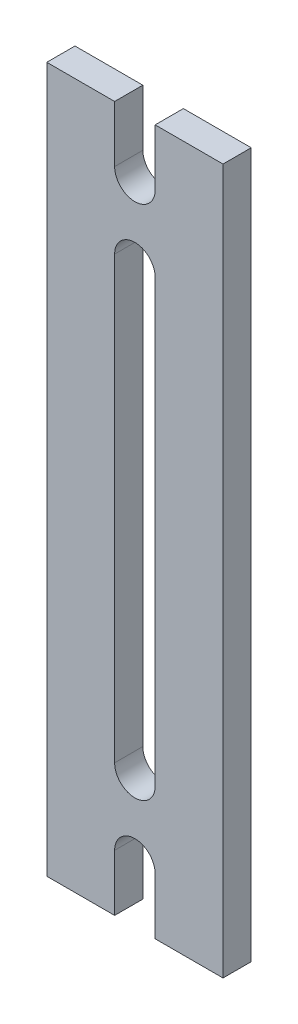
ISO-10303-21;
HEADER;
FILE_DESCRIPTION(('STEP AP214'),'2;1');
FILE_NAME('part.step','',(''),(''),'','','');
FILE_SCHEMA(('AUTOMOTIVE_DESIGN { 1 0 10303 214 1 1 1 1 }'));
ENDSEC;
DATA;
#1=APPLICATION_CONTEXT('core data for automotive mechanical design processes');
#2=APPLICATION_PROTOCOL_DEFINITION('international standard','automotive_design',2000,#1);
#3=PRODUCT_CONTEXT('',#1,'mechanical');
#4=PRODUCT('Part','Part','',(#3));
#5=PRODUCT_RELATED_PRODUCT_CATEGORY('part','',(#4));
#6=PRODUCT_DEFINITION_FORMATION('','',#4);
#7=PRODUCT_DEFINITION_CONTEXT('part definition',#1,'design');
#8=PRODUCT_DEFINITION('design','',#6,#7);
#9=PRODUCT_DEFINITION_SHAPE('','',#8);
#10=(LENGTH_UNIT() NAMED_UNIT(*) SI_UNIT(.MILLI.,.METRE.));
#11=(NAMED_UNIT(*) PLANE_ANGLE_UNIT() SI_UNIT($,.RADIAN.));
#12=(NAMED_UNIT(*) SI_UNIT($,.STERADIAN.) SOLID_ANGLE_UNIT());
#13=UNCERTAINTY_MEASURE_WITH_UNIT(LENGTH_MEASURE(1.E-05),#10,'distance_accuracy_value','');
#14=(GEOMETRIC_REPRESENTATION_CONTEXT(3) GLOBAL_UNCERTAINTY_ASSIGNED_CONTEXT((#13)) GLOBAL_UNIT_ASSIGNED_CONTEXT((#10,
#11,#12)) REPRESENTATION_CONTEXT('',''));
#15=CARTESIAN_POINT('',(0.,0.,0.));
#16=DIRECTION('',(0.,0.,1.));
#17=DIRECTION('',(1.,0.,0.));
#18=AXIS2_PLACEMENT_3D('',#15,#16,#17);
#19=CARTESIAN_POINT('',(-5.,20.,1.6));
#20=DIRECTION('',(0.,-1.,0.));
#21=DIRECTION('',(0.,0.,-1.));
#22=AXIS2_PLACEMENT_3D('',#19,#20,#21);
#23=PLANE('',#22);
#24=DIRECTION('',(-1.,0.,0.));
#25=VECTOR('',#24,1.);
#26=CARTESIAN_POINT('',(-5.,20.,0.));
#27=LINE('',#26,#25);
#28=CARTESIAN_POINT('',(5.,20.,0.));
#29=VERTEX_POINT('',#28);
#30=CARTESIAN_POINT('',(1.15000000000001,20.,0.));
#31=VERTEX_POINT('',#30);
#32=EDGE_CURVE('E250',#29,#31,#27,.T.);
#33=ORIENTED_EDGE('',*,*,#32,.T.);
#34=DIRECTION('',(0.,0.,1.));
#35=VECTOR('',#34,1.);
#36=CARTESIAN_POINT('',(1.15000000000001,20.,1.6));
#37=LINE('',#36,#35);
#38=CARTESIAN_POINT('',(1.15000000000001,20.,1.6));
#39=VERTEX_POINT('',#38);
#40=EDGE_CURVE('E158',#31,#39,#37,.T.);
#41=ORIENTED_EDGE('',*,*,#40,.T.);
#42=DIRECTION('',(-1.,0.,0.));
#43=VECTOR('',#42,1.);
#44=CARTESIAN_POINT('',(-5.,20.,1.6));
#45=LINE('',#44,#43);
#46=CARTESIAN_POINT('',(5.,20.,1.6));
#47=VERTEX_POINT('',#46);
#48=EDGE_CURVE('E237',#47,#39,#45,.T.);
#49=ORIENTED_EDGE('',*,*,#48,.F.);
#50=DIRECTION('',(0.,0.,-1.));
#51=VECTOR('',#50,1.);
#52=CARTESIAN_POINT('',(5.,20.,1.6));
#53=LINE('',#52,#51);
#54=EDGE_CURVE('E265',#47,#29,#53,.T.);
#55=ORIENTED_EDGE('',*,*,#54,.T.);
#56=EDGE_LOOP('',(#33,#41,#49,#55));
#57=FACE_BOUND('',#56,.T.);
#58=ADVANCED_FACE('F33',(#57),#23,.F.);
#59=CARTESIAN_POINT('',(-5.,-20.,1.6));
#60=DIRECTION('',(0.,1.,0.));
#61=DIRECTION('',(0.,0.,1.));
#62=AXIS2_PLACEMENT_3D('',#59,#60,#61);
#63=PLANE('',#62);
#64=DIRECTION('',(1.,0.,0.));
#65=VECTOR('',#64,1.);
#66=CARTESIAN_POINT('',(-5.,-20.,1.6));
#67=LINE('',#66,#65);
#68=CARTESIAN_POINT('',(1.15,-20.,1.6));
#69=VERTEX_POINT('',#68);
#70=CARTESIAN_POINT('',(5.,-20.,1.6));
#71=VERTEX_POINT('',#70);
#72=EDGE_CURVE('E242',#69,#71,#67,.T.);
#73=ORIENTED_EDGE('',*,*,#72,.F.);
#74=DIRECTION('',(0.,0.,-1.));
#75=VECTOR('',#74,1.);
#76=CARTESIAN_POINT('',(1.15,-20.,1.6));
#77=LINE('',#76,#75);
#78=CARTESIAN_POINT('',(1.15,-20.,0.));
#79=VERTEX_POINT('',#78);
#80=EDGE_CURVE('E192',#69,#79,#77,.T.);
#81=ORIENTED_EDGE('',*,*,#80,.T.);
#82=DIRECTION('',(1.,0.,0.));
#83=VECTOR('',#82,1.);
#84=CARTESIAN_POINT('',(-5.,-20.,0.));
#85=LINE('',#84,#83);
#86=CARTESIAN_POINT('',(5.,-20.,0.));
#87=VERTEX_POINT('',#86);
#88=EDGE_CURVE('E254',#79,#87,#85,.T.);
#89=ORIENTED_EDGE('',*,*,#88,.T.);
#90=DIRECTION('',(0.,0.,-1.));
#91=VECTOR('',#90,1.);
#92=CARTESIAN_POINT('',(5.,-20.,1.6));
#93=LINE('',#92,#91);
#94=EDGE_CURVE('E246',#71,#87,#93,.T.);
#95=ORIENTED_EDGE('',*,*,#94,.F.);
#96=EDGE_LOOP('',(#73,#81,#89,#95));
#97=FACE_BOUND('',#96,.T.);
#98=ADVANCED_FACE('F275',(#97),#63,.F.);
#99=CARTESIAN_POINT('',(5.,-20.,1.6));
#100=DIRECTION('',(-1.,0.,0.));
#101=DIRECTION('',(0.,0.,1.));
#102=AXIS2_PLACEMENT_3D('',#99,#100,#101);
#103=PLANE('',#102);
#104=DIRECTION('',(0.,1.,0.));
#105=VECTOR('',#104,1.);
#106=CARTESIAN_POINT('',(5.,-20.,0.));
#107=LINE('',#106,#105);
#108=EDGE_CURVE('E225',#87,#29,#107,.T.);
#109=ORIENTED_EDGE('',*,*,#108,.T.);
#110=ORIENTED_EDGE('',*,*,#54,.F.);
#111=DIRECTION('',(0.,1.,0.));
#112=VECTOR('',#111,1.);
#113=CARTESIAN_POINT('',(5.,-20.,1.6));
#114=LINE('',#113,#112);
#115=EDGE_CURVE('E232',#71,#47,#114,.T.);
#116=ORIENTED_EDGE('',*,*,#115,.F.);
#117=ORIENTED_EDGE('',*,*,#94,.T.);
#118=EDGE_LOOP('',(#109,#110,#116,#117));
#119=FACE_BOUND('',#118,.T.);
#120=ADVANCED_FACE('F35',(#119),#103,.F.);
#121=CARTESIAN_POINT('',(-1.15,20.,1.6));
#122=VERTEX_POINT('',#121);
#123=CARTESIAN_POINT('',(-5.,20.,1.6));
#124=VERTEX_POINT('',#123);
#125=EDGE_CURVE('E235',#122,#124,#45,.T.);
#126=ORIENTED_EDGE('',*,*,#125,.F.);
#127=DIRECTION('',(0.,0.,-1.));
#128=VECTOR('',#127,1.);
#129=CARTESIAN_POINT('',(-1.15,20.,1.6));
#130=LINE('',#129,#128);
#131=CARTESIAN_POINT('',(-1.15,20.,0.));
#132=VERTEX_POINT('',#131);
#133=EDGE_CURVE('E195',#122,#132,#130,.T.);
#134=ORIENTED_EDGE('',*,*,#133,.T.);
#135=CARTESIAN_POINT('',(-5.,20.,0.));
#136=VERTEX_POINT('',#135);
#137=EDGE_CURVE('E249',#132,#136,#27,.T.);
#138=ORIENTED_EDGE('',*,*,#137,.T.);
#139=DIRECTION('',(0.,0.,-1.));
#140=VECTOR('',#139,1.);
#141=CARTESIAN_POINT('',(-5.,20.,1.6));
#142=LINE('',#141,#140);
#143=EDGE_CURVE('E262',#124,#136,#142,.T.);
#144=ORIENTED_EDGE('',*,*,#143,.F.);
#145=EDGE_LOOP('',(#126,#134,#138,#144));
#146=FACE_BOUND('',#145,.T.);
#147=ADVANCED_FACE('F299',(#146),#23,.F.);
#148=CARTESIAN_POINT('',(-5.,-20.,1.6));
#149=DIRECTION('',(1.,0.,0.));
#150=DIRECTION('',(0.,0.,-1.));
#151=AXIS2_PLACEMENT_3D('',#148,#149,#150);
#152=PLANE('',#151);
#153=DIRECTION('',(0.,-1.,0.));
#154=VECTOR('',#153,1.);
#155=CARTESIAN_POINT('',(-5.,-20.,0.));
#156=LINE('',#155,#154);
#157=CARTESIAN_POINT('',(-5.,-20.,0.));
#158=VERTEX_POINT('',#157);
#159=EDGE_CURVE('E252',#136,#158,#156,.T.);
#160=ORIENTED_EDGE('',*,*,#159,.T.);
#161=DIRECTION('',(0.,0.,-1.));
#162=VECTOR('',#161,1.);
#163=CARTESIAN_POINT('',(-5.,-20.,1.6));
#164=LINE('',#163,#162);
#165=CARTESIAN_POINT('',(-5.,-20.,1.6));
#166=VERTEX_POINT('',#165);
#167=EDGE_CURVE('E259',#166,#158,#164,.T.);
#168=ORIENTED_EDGE('',*,*,#167,.F.);
#169=DIRECTION('',(0.,-1.,0.));
#170=VECTOR('',#169,1.);
#171=CARTESIAN_POINT('',(-5.,-20.,1.6));
#172=LINE('',#171,#170);
#173=EDGE_CURVE('E240',#124,#166,#172,.T.);
#174=ORIENTED_EDGE('',*,*,#173,.F.);
#175=ORIENTED_EDGE('',*,*,#143,.T.);
#176=EDGE_LOOP('',(#160,#168,#174,#175));
#177=FACE_BOUND('',#176,.T.);
#178=ADVANCED_FACE('F295',(#177),#152,.F.);
#179=CARTESIAN_POINT('',(-1.15,-20.,0.));
#180=VERTEX_POINT('',#179);
#181=EDGE_CURVE('E236',#158,#180,#85,.T.);
#182=ORIENTED_EDGE('',*,*,#181,.T.);
#183=DIRECTION('',(0.,0.,1.));
#184=VECTOR('',#183,1.);
#185=CARTESIAN_POINT('',(-1.15,-20.,1.6));
#186=LINE('',#185,#184);
#187=CARTESIAN_POINT('',(-1.15,-20.,1.6));
#188=VERTEX_POINT('',#187);
#189=EDGE_CURVE('E56',#180,#188,#186,.T.);
#190=ORIENTED_EDGE('',*,*,#189,.T.);
#191=EDGE_CURVE('E243',#166,#188,#67,.T.);
#192=ORIENTED_EDGE('',*,*,#191,.F.);
#193=ORIENTED_EDGE('',*,*,#167,.T.);
#194=EDGE_LOOP('',(#182,#190,#192,#193));
#195=FACE_BOUND('',#194,.T.);
#196=ADVANCED_FACE('F290',(#195),#63,.F.);
#197=CARTESIAN_POINT('',(0.,0.,1.6));
#198=DIRECTION('',(0.,0.,-1.));
#199=DIRECTION('',(-1.,0.,0.));
#200=AXIS2_PLACEMENT_3D('',#197,#198,#199);
#201=PLANE('',#200);
#202=DIRECTION('',(0.,-1.,0.));
#203=VECTOR('',#202,1.);
#204=CARTESIAN_POINT('',(-1.15000000000001,12.5,1.6));
#205=LINE('',#204,#203);
#206=CARTESIAN_POINT('',(-1.15000000000001,12.5,1.6));
#207=VERTEX_POINT('',#206);
#208=CARTESIAN_POINT('',(-1.15,-12.5,1.6));
#209=VERTEX_POINT('',#208);
#210=EDGE_CURVE('E215',#207,#209,#205,.T.);
#211=ORIENTED_EDGE('',*,*,#210,.F.);
#212=CARTESIAN_POINT('',(0.,12.5,1.6));
#213=DIRECTION('',(0.,0.,1.));
#214=DIRECTION('',(1.,0.,0.));
#215=AXIS2_PLACEMENT_3D('',#212,#213,#214);
#216=CIRCLE('',#215,1.15000000000001);
#217=CARTESIAN_POINT('',(1.15,12.5,1.6));
#218=VERTEX_POINT('',#217);
#219=EDGE_CURVE('E199',#218,#207,#216,.T.);
#220=ORIENTED_EDGE('',*,*,#219,.F.);
#221=DIRECTION('',(0.,1.,0.));
#222=VECTOR('',#221,1.);
#223=CARTESIAN_POINT('',(1.15,12.5,1.6));
#224=LINE('',#223,#222);
#225=CARTESIAN_POINT('',(1.15000000000001,-12.5,1.6));
#226=VERTEX_POINT('',#225);
#227=EDGE_CURVE('E204',#226,#218,#224,.T.);
#228=ORIENTED_EDGE('',*,*,#227,.F.);
#229=CARTESIAN_POINT('',(0.,-12.5,1.6));
#230=DIRECTION('',(0.,0.,1.));
#231=DIRECTION('',(1.,0.,0.));
#232=AXIS2_PLACEMENT_3D('',#229,#230,#231);
#233=CIRCLE('',#232,1.15000000000001);
#234=EDGE_CURVE('E218',#209,#226,#233,.T.);
#235=ORIENTED_EDGE('',*,*,#234,.F.);
#236=EDGE_LOOP('',(#211,#220,#228,#235));
#237=FACE_BOUND('',#236,.T.);
#238=ORIENTED_EDGE('',*,*,#48,.T.);
#239=DIRECTION('',(0.,1.,0.));
#240=VECTOR('',#239,1.);
#241=CARTESIAN_POINT('',(1.15,41.8,1.6));
#242=LINE('',#241,#240);
#243=CARTESIAN_POINT('',(1.15000000000001,16.8,1.6));
#244=VERTEX_POINT('',#243);
#245=EDGE_CURVE('E166',#244,#39,#242,.T.);
#246=ORIENTED_EDGE('',*,*,#245,.F.);
#247=CARTESIAN_POINT('',(0.,16.8,1.6));
#248=DIRECTION('',(0.,0.,1.));
#249=DIRECTION('',(1.,0.,0.));
#250=AXIS2_PLACEMENT_3D('',#247,#248,#249);
#251=CIRCLE('',#250,1.15);
#252=CARTESIAN_POINT('',(-1.15,16.8,1.6));
#253=VERTEX_POINT('',#252);
#254=EDGE_CURVE('E149',#253,#244,#251,.T.);
#255=ORIENTED_EDGE('',*,*,#254,.F.);
#256=DIRECTION('',(0.,-1.,0.));
#257=VECTOR('',#256,1.);
#258=CARTESIAN_POINT('',(-1.15,41.8,1.6));
#259=LINE('',#258,#257);
#260=EDGE_CURVE('E170',#122,#253,#259,.T.);
#261=ORIENTED_EDGE('',*,*,#260,.F.);
#262=ORIENTED_EDGE('',*,*,#125,.T.);
#263=ORIENTED_EDGE('',*,*,#173,.T.);
#264=ORIENTED_EDGE('',*,*,#191,.T.);
#265=DIRECTION('',(0.,-1.,0.));
#266=VECTOR('',#265,1.);
#267=CARTESIAN_POINT('',(-1.15,-16.8,1.6));
#268=LINE('',#267,#266);
#269=CARTESIAN_POINT('',(-1.15,-16.8,1.6));
#270=VERTEX_POINT('',#269);
#271=EDGE_CURVE('E185',#270,#188,#268,.T.);
#272=ORIENTED_EDGE('',*,*,#271,.F.);
#273=CARTESIAN_POINT('',(0.,-16.8,1.6));
#274=DIRECTION('',(0.,0.,1.));
#275=DIRECTION('',(1.,0.,0.));
#276=AXIS2_PLACEMENT_3D('',#273,#274,#275);
#277=CIRCLE('',#276,1.15);
#278=CARTESIAN_POINT('',(1.15,-16.8,1.6));
#279=VERTEX_POINT('',#278);
#280=EDGE_CURVE('E182',#279,#270,#277,.T.);
#281=ORIENTED_EDGE('',*,*,#280,.F.);
#282=DIRECTION('',(0.,1.,0.));
#283=VECTOR('',#282,1.);
#284=CARTESIAN_POINT('',(1.15,-16.8,1.6));
#285=LINE('',#284,#283);
#286=EDGE_CURVE('E179',#69,#279,#285,.T.);
#287=ORIENTED_EDGE('',*,*,#286,.F.);
#288=ORIENTED_EDGE('',*,*,#72,.T.);
#289=ORIENTED_EDGE('',*,*,#115,.T.);
#290=EDGE_LOOP('',(#238,#246,#255,#261,#262,#263,#264,#272,#281,#287,#288,#289));
#291=FACE_BOUND('',#290,.T.);
#292=ADVANCED_FACE('F282',(#237,#291),#201,.F.);
#293=CARTESIAN_POINT('',(0.,0.,0.));
#294=DIRECTION('',(0.,0.,-1.));
#295=DIRECTION('',(-1.,0.,0.));
#296=AXIS2_PLACEMENT_3D('',#293,#294,#295);
#297=PLANE('',#296);
#298=DIRECTION('',(0.,1.,0.));
#299=VECTOR('',#298,1.);
#300=CARTESIAN_POINT('',(1.15,41.8,0.));
#301=LINE('',#300,#299);
#302=CARTESIAN_POINT('',(1.15000000000001,16.8,0.));
#303=VERTEX_POINT('',#302);
#304=EDGE_CURVE('E155',#303,#31,#301,.T.);
#305=ORIENTED_EDGE('',*,*,#304,.T.);
#306=ORIENTED_EDGE('',*,*,#32,.F.);
#307=ORIENTED_EDGE('',*,*,#108,.F.);
#308=ORIENTED_EDGE('',*,*,#88,.F.);
#309=DIRECTION('',(0.,-1.,0.));
#310=VECTOR('',#309,1.);
#311=CARTESIAN_POINT('',(1.15,0.,0.));
#312=LINE('',#311,#310);
#313=CARTESIAN_POINT('',(1.15,-16.8,0.));
#314=VERTEX_POINT('',#313);
#315=EDGE_CURVE('E41',#314,#79,#312,.T.);
#316=ORIENTED_EDGE('',*,*,#315,.F.);
#317=CARTESIAN_POINT('',(0.,-16.8,0.));
#318=DIRECTION('',(0.,0.,1.));
#319=DIRECTION('',(1.,0.,0.));
#320=AXIS2_PLACEMENT_3D('',#317,#318,#319);
#321=CIRCLE('',#320,1.15);
#322=CARTESIAN_POINT('',(-1.15,-16.8,0.));
#323=VERTEX_POINT('',#322);
#324=EDGE_CURVE('E175',#314,#323,#321,.T.);
#325=ORIENTED_EDGE('',*,*,#324,.T.);
#326=DIRECTION('',(0.,-1.,0.));
#327=VECTOR('',#326,1.);
#328=CARTESIAN_POINT('',(-1.15,-16.8,0.));
#329=LINE('',#328,#327);
#330=EDGE_CURVE('E178',#323,#180,#329,.T.);
#331=ORIENTED_EDGE('',*,*,#330,.T.);
#332=ORIENTED_EDGE('',*,*,#181,.F.);
#333=ORIENTED_EDGE('',*,*,#159,.F.);
#334=ORIENTED_EDGE('',*,*,#137,.F.);
#335=DIRECTION('',(0.,1.,0.));
#336=VECTOR('',#335,1.);
#337=CARTESIAN_POINT('',(-1.15,0.,0.));
#338=LINE('',#337,#336);
#339=CARTESIAN_POINT('',(-1.15,16.8,0.));
#340=VERTEX_POINT('',#339);
#341=EDGE_CURVE('E11',#340,#132,#338,.T.);
#342=ORIENTED_EDGE('',*,*,#341,.F.);
#343=CARTESIAN_POINT('',(0.,16.8,0.));
#344=DIRECTION('',(0.,0.,1.));
#345=DIRECTION('',(1.,0.,0.));
#346=AXIS2_PLACEMENT_3D('',#343,#344,#345);
#347=CIRCLE('',#346,1.15);
#348=EDGE_CURVE('E48',#340,#303,#347,.T.);
#349=ORIENTED_EDGE('',*,*,#348,.T.);
#350=EDGE_LOOP('',(#305,#306,#307,#308,#316,#325,#331,#332,#333,#334,#342,#349));
#351=FACE_BOUND('',#350,.T.);
#352=CARTESIAN_POINT('',(0.,12.5,0.));
#353=DIRECTION('',(0.,0.,1.));
#354=DIRECTION('',(1.,0.,0.));
#355=AXIS2_PLACEMENT_3D('',#352,#353,#354);
#356=CIRCLE('',#355,1.15000000000001);
#357=CARTESIAN_POINT('',(1.15,12.5,0.));
#358=VERTEX_POINT('',#357);
#359=CARTESIAN_POINT('',(-1.15000000000001,12.5,0.));
#360=VERTEX_POINT('',#359);
#361=EDGE_CURVE('E200',#358,#360,#356,.T.);
#362=ORIENTED_EDGE('',*,*,#361,.T.);
#363=DIRECTION('',(0.,-1.,0.));
#364=VECTOR('',#363,1.);
#365=CARTESIAN_POINT('',(-1.15000000000001,12.5,0.));
#366=LINE('',#365,#364);
#367=CARTESIAN_POINT('',(-1.15,-12.5,0.));
#368=VERTEX_POINT('',#367);
#369=EDGE_CURVE('E203',#360,#368,#366,.T.);
#370=ORIENTED_EDGE('',*,*,#369,.T.);
#371=CARTESIAN_POINT('',(0.,-12.5,0.));
#372=DIRECTION('',(0.,0.,1.));
#373=DIRECTION('',(1.,0.,0.));
#374=AXIS2_PLACEMENT_3D('',#371,#372,#373);
#375=CIRCLE('',#374,1.15000000000001);
#376=CARTESIAN_POINT('',(1.15000000000001,-12.5,0.));
#377=VERTEX_POINT('',#376);
#378=EDGE_CURVE('E207',#368,#377,#375,.T.);
#379=ORIENTED_EDGE('',*,*,#378,.T.);
#380=DIRECTION('',(0.,1.,0.));
#381=VECTOR('',#380,1.);
#382=CARTESIAN_POINT('',(1.15,12.5,0.));
#383=LINE('',#382,#381);
#384=EDGE_CURVE('E210',#377,#358,#383,.T.);
#385=ORIENTED_EDGE('',*,*,#384,.T.);
#386=EDGE_LOOP('',(#362,#370,#379,#385));
#387=FACE_BOUND('',#386,.T.);
#388=ADVANCED_FACE('F163',(#351,#387),#297,.T.);
#389=CARTESIAN_POINT('',(0.,12.5,0.));
#390=DIRECTION('',(0.,0.,1.));
#391=DIRECTION('',(1.,0.,0.));
#392=AXIS2_PLACEMENT_3D('',#389,#390,#391);
#393=CYLINDRICAL_SURFACE('',#392,1.15000000000001);
#394=ORIENTED_EDGE('',*,*,#219,.T.);
#395=DIRECTION('',(0.,0.,1.));
#396=VECTOR('',#395,1.);
#397=CARTESIAN_POINT('',(-1.15000000000001,12.5,0.));
#398=LINE('',#397,#396);
#399=EDGE_CURVE('E213',#360,#207,#398,.T.);
#400=ORIENTED_EDGE('',*,*,#399,.F.);
#401=ORIENTED_EDGE('',*,*,#361,.F.);
#402=DIRECTION('',(0.,0.,1.));
#403=VECTOR('',#402,1.);
#404=CARTESIAN_POINT('',(1.15,12.5,0.));
#405=LINE('',#404,#403);
#406=EDGE_CURVE('E223',#358,#218,#405,.T.);
#407=ORIENTED_EDGE('',*,*,#406,.T.);
#408=EDGE_LOOP('',(#394,#400,#401,#407));
#409=FACE_BOUND('',#408,.T.);
#410=ADVANCED_FACE('F354',(#409),#393,.F.);
#411=CARTESIAN_POINT('',(1.15,12.5,0.));
#412=DIRECTION('',(1.,0.,0.));
#413=DIRECTION('',(0.,1.,0.));
#414=AXIS2_PLACEMENT_3D('',#411,#412,#413);
#415=PLANE('',#414);
#416=ORIENTED_EDGE('',*,*,#227,.T.);
#417=ORIENTED_EDGE('',*,*,#406,.F.);
#418=ORIENTED_EDGE('',*,*,#384,.F.);
#419=DIRECTION('',(0.,0.,1.));
#420=VECTOR('',#419,1.);
#421=CARTESIAN_POINT('',(1.15000000000001,-12.5,0.));
#422=LINE('',#421,#420);
#423=EDGE_CURVE('E226',#377,#226,#422,.T.);
#424=ORIENTED_EDGE('',*,*,#423,.T.);
#425=EDGE_LOOP('',(#416,#417,#418,#424));
#426=FACE_BOUND('',#425,.T.);
#427=ADVANCED_FACE('F363',(#426),#415,.F.);
#428=CARTESIAN_POINT('',(0.,-12.5,0.));
#429=DIRECTION('',(0.,0.,1.));
#430=DIRECTION('',(1.,0.,0.));
#431=AXIS2_PLACEMENT_3D('',#428,#429,#430);
#432=CYLINDRICAL_SURFACE('',#431,1.15000000000001);
#433=ORIENTED_EDGE('',*,*,#234,.T.);
#434=ORIENTED_EDGE('',*,*,#423,.F.);
#435=ORIENTED_EDGE('',*,*,#378,.F.);
#436=DIRECTION('',(0.,0.,1.));
#437=VECTOR('',#436,1.);
#438=CARTESIAN_POINT('',(-1.15,-12.5,0.));
#439=LINE('',#438,#437);
#440=EDGE_CURVE('E228',#368,#209,#439,.T.);
#441=ORIENTED_EDGE('',*,*,#440,.T.);
#442=EDGE_LOOP('',(#433,#434,#435,#441));
#443=FACE_BOUND('',#442,.T.);
#444=ADVANCED_FACE('F373',(#443),#432,.F.);
#445=CARTESIAN_POINT('',(-1.15000000000001,12.5,0.));
#446=DIRECTION('',(-1.,0.,0.));
#447=DIRECTION('',(0.,-1.,0.));
#448=AXIS2_PLACEMENT_3D('',#445,#446,#447);
#449=PLANE('',#448);
#450=ORIENTED_EDGE('',*,*,#210,.T.);
#451=ORIENTED_EDGE('',*,*,#440,.F.);
#452=ORIENTED_EDGE('',*,*,#369,.F.);
#453=ORIENTED_EDGE('',*,*,#399,.T.);
#454=EDGE_LOOP('',(#450,#451,#452,#453));
#455=FACE_BOUND('',#454,.T.);
#456=ADVANCED_FACE('F383',(#455),#449,.F.);
#457=CARTESIAN_POINT('',(1.15,-16.8,0.));
#458=DIRECTION('',(1.,0.,0.));
#459=DIRECTION('',(0.,1.,0.));
#460=AXIS2_PLACEMENT_3D('',#457,#458,#459);
#461=PLANE('',#460);
#462=ORIENTED_EDGE('',*,*,#286,.T.);
#463=DIRECTION('',(0.,0.,1.));
#464=VECTOR('',#463,1.);
#465=CARTESIAN_POINT('',(1.15,-16.8,0.));
#466=LINE('',#465,#464);
#467=EDGE_CURVE('E172',#314,#279,#466,.T.);
#468=ORIENTED_EDGE('',*,*,#467,.F.);
#469=ORIENTED_EDGE('',*,*,#315,.T.);
#470=ORIENTED_EDGE('',*,*,#80,.F.);
#471=EDGE_LOOP('',(#462,#468,#469,#470));
#472=FACE_BOUND('',#471,.T.);
#473=ADVANCED_FACE('F269',(#472),#461,.F.);
#474=CARTESIAN_POINT('',(-1.15,-16.8,0.));
#475=DIRECTION('',(-1.,0.,0.));
#476=DIRECTION('',(0.,-1.,0.));
#477=AXIS2_PLACEMENT_3D('',#474,#475,#476);
#478=PLANE('',#477);
#479=ORIENTED_EDGE('',*,*,#330,.F.);
#480=DIRECTION('',(0.,0.,1.));
#481=VECTOR('',#480,1.);
#482=CARTESIAN_POINT('',(-1.15,-16.8,0.));
#483=LINE('',#482,#481);
#484=EDGE_CURVE('E181',#323,#270,#483,.T.);
#485=ORIENTED_EDGE('',*,*,#484,.T.);
#486=ORIENTED_EDGE('',*,*,#271,.T.);
#487=ORIENTED_EDGE('',*,*,#189,.F.);
#488=EDGE_LOOP('',(#479,#485,#486,#487));
#489=FACE_BOUND('',#488,.T.);
#490=ADVANCED_FACE('F402',(#489),#478,.F.);
#491=CARTESIAN_POINT('',(0.,-16.8,0.));
#492=DIRECTION('',(0.,0.,1.));
#493=DIRECTION('',(1.,0.,0.));
#494=AXIS2_PLACEMENT_3D('',#491,#492,#493);
#495=CYLINDRICAL_SURFACE('',#494,1.15);
#496=ORIENTED_EDGE('',*,*,#280,.T.);
#497=ORIENTED_EDGE('',*,*,#484,.F.);
#498=ORIENTED_EDGE('',*,*,#324,.F.);
#499=ORIENTED_EDGE('',*,*,#467,.T.);
#500=EDGE_LOOP('',(#496,#497,#498,#499));
#501=FACE_BOUND('',#500,.T.);
#502=ADVANCED_FACE('F286',(#501),#495,.F.);
#503=CARTESIAN_POINT('',(1.15,41.8,0.));
#504=DIRECTION('',(1.,0.,0.));
#505=DIRECTION('',(0.,1.,0.));
#506=AXIS2_PLACEMENT_3D('',#503,#504,#505);
#507=PLANE('',#506);
#508=ORIENTED_EDGE('',*,*,#304,.F.);
#509=DIRECTION('',(0.,0.,1.));
#510=VECTOR('',#509,1.);
#511=CARTESIAN_POINT('',(1.15000000000001,16.8,0.));
#512=LINE('',#511,#510);
#513=EDGE_CURVE('E145',#303,#244,#512,.T.);
#514=ORIENTED_EDGE('',*,*,#513,.T.);
#515=ORIENTED_EDGE('',*,*,#245,.T.);
#516=ORIENTED_EDGE('',*,*,#40,.F.);
#517=EDGE_LOOP('',(#508,#514,#515,#516));
#518=FACE_BOUND('',#517,.T.);
#519=ADVANCED_FACE('F156',(#518),#507,.F.);
#520=CARTESIAN_POINT('',(-1.15,41.8,0.));
#521=DIRECTION('',(-1.,0.,0.));
#522=DIRECTION('',(0.,-1.,0.));
#523=AXIS2_PLACEMENT_3D('',#520,#521,#522);
#524=PLANE('',#523);
#525=ORIENTED_EDGE('',*,*,#260,.T.);
#526=DIRECTION('',(0.,0.,1.));
#527=VECTOR('',#526,1.);
#528=CARTESIAN_POINT('',(-1.15,16.8,0.));
#529=LINE('',#528,#527);
#530=EDGE_CURVE('E152',#340,#253,#529,.T.);
#531=ORIENTED_EDGE('',*,*,#530,.F.);
#532=ORIENTED_EDGE('',*,*,#341,.T.);
#533=ORIENTED_EDGE('',*,*,#133,.F.);
#534=EDGE_LOOP('',(#525,#531,#532,#533));
#535=FACE_BOUND('',#534,.T.);
#536=ADVANCED_FACE('F302',(#535),#524,.F.);
#537=CARTESIAN_POINT('',(0.,16.8,0.));
#538=DIRECTION('',(0.,0.,1.));
#539=DIRECTION('',(1.,0.,0.));
#540=AXIS2_PLACEMENT_3D('',#537,#538,#539);
#541=CYLINDRICAL_SURFACE('',#540,1.15);
#542=ORIENTED_EDGE('',*,*,#254,.T.);
#543=ORIENTED_EDGE('',*,*,#513,.F.);
#544=ORIENTED_EDGE('',*,*,#348,.F.);
#545=ORIENTED_EDGE('',*,*,#530,.T.);
#546=EDGE_LOOP('',(#542,#543,#544,#545));
#547=FACE_BOUND('',#546,.T.);
#548=ADVANCED_FACE('F147',(#547),#541,.F.);
#549=CLOSED_SHELL('',(#58,#98,#120,#147,#178,#196,#292,#388,#410,#427,#444,#456,#473,#490,#502,
#519,#536,#548));
#550=MANIFOLD_SOLID_BREP('B2',#549);
#551=ADVANCED_BREP_SHAPE_REPRESENTATION('',(#18,#550),#14);
#552=SHAPE_DEFINITION_REPRESENTATION(#9,#551);
ENDSEC;
END-ISO-10303-21;
